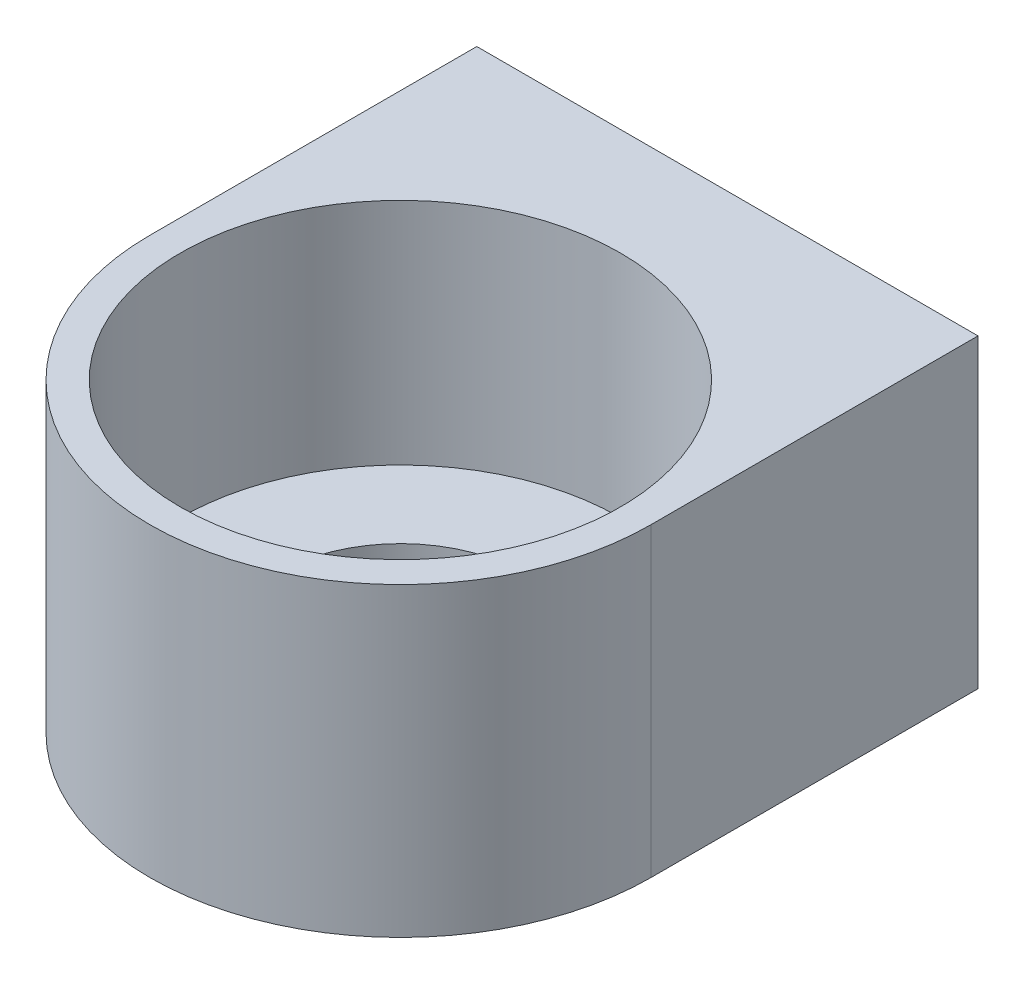
ISO-10303-21;
HEADER;
FILE_DESCRIPTION(('STEP AP214'),'2;1');
FILE_NAME('part.step','',(''),(''),'','','');
FILE_SCHEMA(('AUTOMOTIVE_DESIGN { 1 0 10303 214 1 1 1 1 }'));
ENDSEC;
DATA;
#1=APPLICATION_CONTEXT('core data for automotive mechanical design processes');
#2=APPLICATION_PROTOCOL_DEFINITION('international standard','automotive_design',2000,#1);
#3=PRODUCT_CONTEXT('',#1,'mechanical');
#4=PRODUCT('Part','Part','',(#3));
#5=PRODUCT_RELATED_PRODUCT_CATEGORY('part','',(#4));
#6=PRODUCT_DEFINITION_FORMATION('','',#4);
#7=PRODUCT_DEFINITION_CONTEXT('part definition',#1,'design');
#8=PRODUCT_DEFINITION('design','',#6,#7);
#9=PRODUCT_DEFINITION_SHAPE('','',#8);
#10=(LENGTH_UNIT() NAMED_UNIT(*) SI_UNIT(.MILLI.,.METRE.));
#11=(NAMED_UNIT(*) PLANE_ANGLE_UNIT() SI_UNIT($,.RADIAN.));
#12=(NAMED_UNIT(*) SI_UNIT($,.STERADIAN.) SOLID_ANGLE_UNIT());
#13=UNCERTAINTY_MEASURE_WITH_UNIT(LENGTH_MEASURE(1.E-05),#10,'distance_accuracy_value','');
#14=(GEOMETRIC_REPRESENTATION_CONTEXT(3) GLOBAL_UNCERTAINTY_ASSIGNED_CONTEXT((#13)) GLOBAL_UNIT_ASSIGNED_CONTEXT((#10,
#11,#12)) REPRESENTATION_CONTEXT('',''));
#15=CARTESIAN_POINT('',(0.,0.,0.));
#16=DIRECTION('',(0.,0.,1.));
#17=DIRECTION('',(1.,0.,0.));
#18=AXIS2_PLACEMENT_3D('',#15,#16,#17);
#19=CARTESIAN_POINT('',(-16.4,100.,0.));
#20=DIRECTION('',(1.,0.,0.));
#21=DIRECTION('',(0.,0.,-1.));
#22=AXIS2_PLACEMENT_3D('',#19,#20,#21);
#23=PLANE('',#22);
#24=DIRECTION('',(0.,0.,1.));
#25=VECTOR('',#24,1.);
#26=CARTESIAN_POINT('',(-16.4,20.,0.));
#27=LINE('',#26,#25);
#28=CARTESIAN_POINT('',(-16.4,20.,-21.4));
#29=VERTEX_POINT('',#28);
#30=CARTESIAN_POINT('',(-16.4,20.,0.));
#31=VERTEX_POINT('',#30);
#32=EDGE_CURVE('E59',#29,#31,#27,.T.);
#33=ORIENTED_EDGE('',*,*,#32,.F.);
#34=DIRECTION('',(0.,-1.,0.));
#35=VECTOR('',#34,1.);
#36=CARTESIAN_POINT('',(-16.4,100.,-21.4));
#37=LINE('',#36,#35);
#38=CARTESIAN_POINT('',(-16.4,0.,-21.4));
#39=VERTEX_POINT('',#38);
#40=EDGE_CURVE('E98',#29,#39,#37,.T.);
#41=ORIENTED_EDGE('',*,*,#40,.T.);
#42=DIRECTION('',(0.,0.,1.));
#43=VECTOR('',#42,1.);
#44=CARTESIAN_POINT('',(-16.4,0.,0.));
#45=LINE('',#44,#43);
#46=CARTESIAN_POINT('',(-16.4,0.,0.));
#47=VERTEX_POINT('',#46);
#48=EDGE_CURVE('E109',#39,#47,#45,.T.);
#49=ORIENTED_EDGE('',*,*,#48,.T.);
#50=DIRECTION('',(0.,-1.,0.));
#51=VECTOR('',#50,1.);
#52=CARTESIAN_POINT('',(-16.4,100.,0.));
#53=LINE('',#52,#51);
#54=EDGE_CURVE('E64',#31,#47,#53,.T.);
#55=ORIENTED_EDGE('',*,*,#54,.F.);
#56=EDGE_LOOP('',(#33,#41,#49,#55));
#57=FACE_BOUND('',#56,.T.);
#58=ADVANCED_FACE('F45',(#57),#23,.F.);
#59=CARTESIAN_POINT('',(0.,100.,0.));
#60=DIRECTION('',(0.,-1.,0.));
#61=DIRECTION('',(0.,0.,-1.));
#62=AXIS2_PLACEMENT_3D('',#59,#60,#61);
#63=CYLINDRICAL_SURFACE('',#62,8.1);
#64=CARTESIAN_POINT('',(0.,0.,0.));
#65=DIRECTION('',(0.,1.,0.));
#66=DIRECTION('',(0.,0.,1.));
#67=AXIS2_PLACEMENT_3D('',#64,#65,#66);
#68=CIRCLE('',#67,8.1);
#69=CARTESIAN_POINT('',(0.,0.,8.1));
#70=VERTEX_POINT('',#69);
#71=EDGE_CURVE('E95',#70,#70,#68,.T.);
#72=ORIENTED_EDGE('',*,*,#71,.F.);
#73=EDGE_LOOP('',(#72));
#74=FACE_BOUND('',#73,.T.);
#75=CARTESIAN_POINT('',(0.,5.,0.));
#76=DIRECTION('',(0.,1.,0.));
#77=DIRECTION('',(0.,0.,1.));
#78=AXIS2_PLACEMENT_3D('',#75,#76,#77);
#79=CIRCLE('',#78,8.1);
#80=CARTESIAN_POINT('',(0.,5.,8.1));
#81=VERTEX_POINT('',#80);
#82=EDGE_CURVE('E46',#81,#81,#79,.T.);
#83=ORIENTED_EDGE('',*,*,#82,.T.);
#84=EDGE_LOOP('',(#83));
#85=FACE_BOUND('',#84,.T.);
#86=ADVANCED_FACE('F181',(#74,#85),#63,.F.);
#87=CARTESIAN_POINT('',(16.4,100.,0.));
#88=DIRECTION('',(-1.,0.,0.));
#89=DIRECTION('',(0.,0.,1.));
#90=AXIS2_PLACEMENT_3D('',#87,#88,#89);
#91=PLANE('',#90);
#92=DIRECTION('',(0.,-1.,0.));
#93=VECTOR('',#92,1.);
#94=CARTESIAN_POINT('',(16.4,100.,-21.4));
#95=LINE('',#94,#93);
#96=CARTESIAN_POINT('',(16.4,20.,-21.4));
#97=VERTEX_POINT('',#96);
#98=CARTESIAN_POINT('',(16.4,0.,-21.4));
#99=VERTEX_POINT('',#98);
#100=EDGE_CURVE('E51',#97,#99,#95,.T.);
#101=ORIENTED_EDGE('',*,*,#100,.F.);
#102=DIRECTION('',(0.,0.,-1.));
#103=VECTOR('',#102,1.);
#104=CARTESIAN_POINT('',(16.4,20.,0.));
#105=LINE('',#104,#103);
#106=CARTESIAN_POINT('',(16.4,20.,0.));
#107=VERTEX_POINT('',#106);
#108=EDGE_CURVE('E83',#107,#97,#105,.T.);
#109=ORIENTED_EDGE('',*,*,#108,.F.);
#110=DIRECTION('',(0.,-1.,0.));
#111=VECTOR('',#110,1.);
#112=CARTESIAN_POINT('',(16.4,100.,0.));
#113=LINE('',#112,#111);
#114=CARTESIAN_POINT('',(16.4,0.,0.));
#115=VERTEX_POINT('',#114);
#116=EDGE_CURVE('E11',#107,#115,#113,.T.);
#117=ORIENTED_EDGE('',*,*,#116,.T.);
#118=DIRECTION('',(0.,0.,-1.));
#119=VECTOR('',#118,1.);
#120=CARTESIAN_POINT('',(16.4,0.,0.));
#121=LINE('',#120,#119);
#122=EDGE_CURVE('E102',#115,#99,#121,.T.);
#123=ORIENTED_EDGE('',*,*,#122,.T.);
#124=EDGE_LOOP('',(#101,#109,#117,#123));
#125=FACE_BOUND('',#124,.T.);
#126=ADVANCED_FACE('F105',(#125),#91,.F.);
#127=CARTESIAN_POINT('',(0.,100.,0.));
#128=DIRECTION('',(0.,-1.,0.));
#129=DIRECTION('',(0.,0.,-1.));
#130=AXIS2_PLACEMENT_3D('',#127,#128,#129);
#131=CYLINDRICAL_SURFACE('',#130,16.4);
#132=CARTESIAN_POINT('',(0.,20.,0.));
#133=DIRECTION('',(0.,1.,0.));
#134=DIRECTION('',(0.,0.,1.));
#135=AXIS2_PLACEMENT_3D('',#132,#133,#134);
#136=CIRCLE('',#135,16.4);
#137=EDGE_CURVE('E86',#31,#107,#136,.T.);
#138=ORIENTED_EDGE('',*,*,#137,.F.);
#139=ORIENTED_EDGE('',*,*,#54,.T.);
#140=CARTESIAN_POINT('',(0.,0.,0.));
#141=DIRECTION('',(0.,1.,0.));
#142=DIRECTION('',(0.,0.,1.));
#143=AXIS2_PLACEMENT_3D('',#140,#141,#142);
#144=CIRCLE('',#143,16.4);
#145=EDGE_CURVE('E113',#47,#115,#144,.T.);
#146=ORIENTED_EDGE('',*,*,#145,.T.);
#147=ORIENTED_EDGE('',*,*,#116,.F.);
#148=EDGE_LOOP('',(#138,#139,#146,#147));
#149=FACE_BOUND('',#148,.T.);
#150=ADVANCED_FACE('F42',(#149),#131,.T.);
#151=CARTESIAN_POINT('',(0.,0.,0.));
#152=DIRECTION('',(0.,1.,0.));
#153=DIRECTION('',(0.,0.,1.));
#154=AXIS2_PLACEMENT_3D('',#151,#152,#153);
#155=PLANE('',#154);
#156=ORIENTED_EDGE('',*,*,#145,.F.);
#157=ORIENTED_EDGE('',*,*,#48,.F.);
#158=DIRECTION('',(-1.,0.,0.));
#159=VECTOR('',#158,1.);
#160=CARTESIAN_POINT('',(-16.4,0.,-21.4));
#161=LINE('',#160,#159);
#162=EDGE_CURVE('E115',#99,#39,#161,.T.);
#163=ORIENTED_EDGE('',*,*,#162,.F.);
#164=ORIENTED_EDGE('',*,*,#122,.F.);
#165=EDGE_LOOP('',(#156,#157,#163,#164));
#166=FACE_BOUND('',#165,.T.);
#167=ORIENTED_EDGE('',*,*,#71,.T.);
#168=EDGE_LOOP('',(#167));
#169=FACE_BOUND('',#168,.T.);
#170=ADVANCED_FACE('F190',(#166,#169),#155,.F.);
#171=CARTESIAN_POINT('',(-16.4,100.,-21.4));
#172=DIRECTION('',(0.,0.,1.));
#173=DIRECTION('',(1.,0.,0.));
#174=AXIS2_PLACEMENT_3D('',#171,#172,#173);
#175=PLANE('',#174);
#176=ORIENTED_EDGE('',*,*,#40,.F.);
#177=DIRECTION('',(1.,0.,0.));
#178=VECTOR('',#177,1.);
#179=CARTESIAN_POINT('',(-16.4,20.,-21.4));
#180=LINE('',#179,#178);
#181=EDGE_CURVE('E88',#29,#97,#180,.T.);
#182=ORIENTED_EDGE('',*,*,#181,.T.);
#183=ORIENTED_EDGE('',*,*,#100,.T.);
#184=ORIENTED_EDGE('',*,*,#162,.T.);
#185=EDGE_LOOP('',(#176,#182,#183,#184));
#186=FACE_BOUND('',#185,.T.);
#187=ADVANCED_FACE('F92',(#186),#175,.F.);
#188=CARTESIAN_POINT('',(0.,20.,0.));
#189=DIRECTION('',(0.,1.,0.));
#190=DIRECTION('',(0.,0.,1.));
#191=AXIS2_PLACEMENT_3D('',#188,#189,#190);
#192=PLANE('',#191);
#193=CARTESIAN_POINT('',(0.,20.,0.));
#194=DIRECTION('',(0.,1.,0.));
#195=DIRECTION('',(0.,0.,1.));
#196=AXIS2_PLACEMENT_3D('',#193,#194,#195);
#197=CIRCLE('',#196,14.4);
#198=CARTESIAN_POINT('',(0.,20.,14.4));
#199=VERTEX_POINT('',#198);
#200=EDGE_CURVE('E97',#199,#199,#197,.T.);
#201=ORIENTED_EDGE('',*,*,#200,.F.);
#202=EDGE_LOOP('',(#201));
#203=FACE_BOUND('',#202,.T.);
#204=ORIENTED_EDGE('',*,*,#108,.T.);
#205=ORIENTED_EDGE('',*,*,#181,.F.);
#206=ORIENTED_EDGE('',*,*,#32,.T.);
#207=ORIENTED_EDGE('',*,*,#137,.T.);
#208=EDGE_LOOP('',(#204,#205,#206,#207));
#209=FACE_BOUND('',#208,.T.);
#210=ADVANCED_FACE('F84',(#203,#209),#192,.T.);
#211=CARTESIAN_POINT('',(0.,5.,0.));
#212=DIRECTION('',(0.,1.,0.));
#213=DIRECTION('',(0.,0.,1.));
#214=AXIS2_PLACEMENT_3D('',#211,#212,#213);
#215=CYLINDRICAL_SURFACE('',#214,14.4);
#216=CARTESIAN_POINT('',(0.,5.,0.));
#217=DIRECTION('',(0.,1.,0.));
#218=DIRECTION('',(0.,0.,1.));
#219=AXIS2_PLACEMENT_3D('',#216,#217,#218);
#220=CIRCLE('',#219,14.4);
#221=CARTESIAN_POINT('',(0.,5.,14.4));
#222=VERTEX_POINT('',#221);
#223=EDGE_CURVE('E123',#222,#222,#220,.T.);
#224=ORIENTED_EDGE('',*,*,#223,.F.);
#225=EDGE_LOOP('',(#224));
#226=FACE_BOUND('',#225,.T.);
#227=ORIENTED_EDGE('',*,*,#200,.T.);
#228=EDGE_LOOP('',(#227));
#229=FACE_BOUND('',#228,.T.);
#230=ADVANCED_FACE('F176',(#226,#229),#215,.F.);
#231=CARTESIAN_POINT('',(0.,5.,0.));
#232=DIRECTION('',(0.,1.,0.));
#233=DIRECTION('',(0.,0.,1.));
#234=AXIS2_PLACEMENT_3D('',#231,#232,#233);
#235=PLANE('',#234);
#236=ORIENTED_EDGE('',*,*,#82,.F.);
#237=EDGE_LOOP('',(#236));
#238=FACE_BOUND('',#237,.T.);
#239=ORIENTED_EDGE('',*,*,#223,.T.);
#240=EDGE_LOOP('',(#239));
#241=FACE_BOUND('',#240,.T.);
#242=ADVANCED_FACE('F171',(#238,#241),#235,.T.);
#243=CLOSED_SHELL('',(#58,#86,#126,#150,#170,#187,#210,#230,#242));
#244=CARTESIAN_POINT('',(-11.3669214310838,14.9,-16.1762282680987));
#245=DIRECTION('',(0.,1.,0.));
#246=DIRECTION('',(0.,0.,1.));
#247=AXIS2_PLACEMENT_3D('',#244,#245,#246);
#248=CYLINDRICAL_SURFACE('',#247,4.1);
#249=CARTESIAN_POINT('',(-11.3669214310838,14.9,-16.1762282680987));
#250=DIRECTION('',(0.,1.,0.));
#251=DIRECTION('',(0.,0.,1.));
#252=AXIS2_PLACEMENT_3D('',#249,#250,#251);
#253=CIRCLE('',#252,4.1);
#254=CARTESIAN_POINT('',(-11.3669214310838,14.9,-12.0762282680987));
#255=VERTEX_POINT('',#254);
#256=EDGE_CURVE('E99',#255,#255,#253,.T.);
#257=CARTESIAN_POINT('',(-11.3669214310838,18.,-16.1762282680987));
#258=DIRECTION('',(0.,1.,0.));
#259=DIRECTION('',(0.,0.,1.));
#260=AXIS2_PLACEMENT_3D('',#257,#258,#259);
#261=CIRCLE('',#260,4.1);
#262=CARTESIAN_POINT('',(-11.3669214310838,18.,-12.0762282680987));
#263=VERTEX_POINT('',#262);
#264=EDGE_CURVE('E127',#263,#263,#261,.T.);
#265=CARTESIAN_POINT('',(-11.3669214310838,14.9,-12.0762282680987));
#266=CARTESIAN_POINT('',(-11.3669214310838,14.9322916666667,-12.0762282680987));
#267=CARTESIAN_POINT('',(-11.3669214310838,14.9645833333333,-12.0762282680987));
#268=CARTESIAN_POINT('',(-11.3669214310838,15.0291666666667,-12.0762282680987));
#269=CARTESIAN_POINT('',(-11.3669214310838,15.0614583333333,-12.0762282680987));
#270=CARTESIAN_POINT('',(-11.3669214310838,15.1260416666667,-12.0762282680987));
#271=CARTESIAN_POINT('',(-11.3669214310838,15.1583333333333,-12.0762282680987));
#272=CARTESIAN_POINT('',(-11.3669214310838,15.2229166666667,-12.0762282680987));
#273=CARTESIAN_POINT('',(-11.3669214310838,15.2552083333333,-12.0762282680987));
#274=CARTESIAN_POINT('',(-11.3669214310838,15.3197916666667,-12.0762282680987));
#275=CARTESIAN_POINT('',(-11.3669214310838,15.3520833333333,-12.0762282680987));
#276=CARTESIAN_POINT('',(-11.3669214310838,15.4166666666667,-12.0762282680987));
#277=CARTESIAN_POINT('',(-11.3669214310838,15.4489583333333,-12.0762282680987));
#278=CARTESIAN_POINT('',(-11.3669214310838,15.5135416666667,-12.0762282680987));
#279=CARTESIAN_POINT('',(-11.3669214310838,15.5458333333333,-12.0762282680987));
#280=CARTESIAN_POINT('',(-11.3669214310838,15.6104166666667,-12.0762282680987));
#281=CARTESIAN_POINT('',(-11.3669214310838,15.6427083333333,-12.0762282680987));
#282=CARTESIAN_POINT('',(-11.3669214310838,15.7072916666667,-12.0762282680987));
#283=CARTESIAN_POINT('',(-11.3669214310838,15.7395833333333,-12.0762282680987));
#284=CARTESIAN_POINT('',(-11.3669214310838,15.8041666666667,-12.0762282680987));
#285=CARTESIAN_POINT('',(-11.3669214310838,15.8364583333333,-12.0762282680987));
#286=CARTESIAN_POINT('',(-11.3669214310838,15.9010416666667,-12.0762282680987));
#287=CARTESIAN_POINT('',(-11.3669214310838,15.9333333333333,-12.0762282680987));
#288=CARTESIAN_POINT('',(-11.3669214310838,15.9979166666667,-12.0762282680987));
#289=CARTESIAN_POINT('',(-11.3669214310838,16.0302083333333,-12.0762282680987));
#290=CARTESIAN_POINT('',(-11.3669214310838,16.0947916666667,-12.0762282680987));
#291=CARTESIAN_POINT('',(-11.3669214310838,16.1270833333333,-12.0762282680987));
#292=CARTESIAN_POINT('',(-11.3669214310838,16.1916666666667,-12.0762282680987));
#293=CARTESIAN_POINT('',(-11.3669214310838,16.2239583333333,-12.0762282680987));
#294=CARTESIAN_POINT('',(-11.3669214310838,16.2885416666667,-12.0762282680987));
#295=CARTESIAN_POINT('',(-11.3669214310838,16.3208333333333,-12.0762282680987));
#296=CARTESIAN_POINT('',(-11.3669214310838,16.3854166666667,-12.0762282680987));
#297=CARTESIAN_POINT('',(-11.3669214310838,16.4177083333333,-12.0762282680987));
#298=CARTESIAN_POINT('',(-11.3669214310838,16.4822916666667,-12.0762282680987));
#299=CARTESIAN_POINT('',(-11.3669214310838,16.5145833333333,-12.0762282680987));
#300=CARTESIAN_POINT('',(-11.3669214310838,16.5791666666667,-12.0762282680987));
#301=CARTESIAN_POINT('',(-11.3669214310838,16.6114583333333,-12.0762282680987));
#302=CARTESIAN_POINT('',(-11.3669214310838,16.6760416666667,-12.0762282680987));
#303=CARTESIAN_POINT('',(-11.3669214310838,16.7083333333333,-12.0762282680987));
#304=CARTESIAN_POINT('',(-11.3669214310838,16.7729166666667,-12.0762282680987));
#305=CARTESIAN_POINT('',(-11.3669214310838,16.8052083333333,-12.0762282680987));
#306=CARTESIAN_POINT('',(-11.3669214310838,16.8697916666667,-12.0762282680987));
#307=CARTESIAN_POINT('',(-11.3669214310838,16.9020833333333,-12.0762282680987));
#308=CARTESIAN_POINT('',(-11.3669214310838,16.9666666666667,-12.0762282680987));
#309=CARTESIAN_POINT('',(-11.3669214310838,16.9989583333333,-12.0762282680987));
#310=CARTESIAN_POINT('',(-11.3669214310838,17.0635416666667,-12.0762282680987));
#311=CARTESIAN_POINT('',(-11.3669214310838,17.0958333333333,-12.0762282680987));
#312=CARTESIAN_POINT('',(-11.3669214310838,17.1604166666667,-12.0762282680987));
#313=CARTESIAN_POINT('',(-11.3669214310838,17.1927083333333,-12.0762282680987));
#314=CARTESIAN_POINT('',(-11.3669214310838,17.2572916666667,-12.0762282680987));
#315=CARTESIAN_POINT('',(-11.3669214310838,17.2895833333333,-12.0762282680987));
#316=CARTESIAN_POINT('',(-11.3669214310838,17.3541666666667,-12.0762282680987));
#317=CARTESIAN_POINT('',(-11.3669214310838,17.3864583333333,-12.0762282680987));
#318=CARTESIAN_POINT('',(-11.3669214310838,17.4510416666667,-12.0762282680987));
#319=CARTESIAN_POINT('',(-11.3669214310838,17.4833333333333,-12.0762282680987));
#320=CARTESIAN_POINT('',(-11.3669214310838,17.5479166666667,-12.0762282680987));
#321=CARTESIAN_POINT('',(-11.3669214310838,17.5802083333333,-12.0762282680987));
#322=CARTESIAN_POINT('',(-11.3669214310838,17.6447916666667,-12.0762282680987));
#323=CARTESIAN_POINT('',(-11.3669214310838,17.6770833333333,-12.0762282680987));
#324=CARTESIAN_POINT('',(-11.3669214310838,17.7416666666667,-12.0762282680987));
#325=CARTESIAN_POINT('',(-11.3669214310838,17.7739583333333,-12.0762282680987));
#326=CARTESIAN_POINT('',(-11.3669214310838,17.8385416666667,-12.0762282680987));
#327=CARTESIAN_POINT('',(-11.3669214310838,17.8708333333333,-12.0762282680987));
#328=CARTESIAN_POINT('',(-11.3669214310838,17.9354166666667,-12.0762282680987));
#329=CARTESIAN_POINT('',(-11.3669214310838,17.9677083333333,-12.0762282680987));
#330=CARTESIAN_POINT('',(-11.3669214310838,18.,-12.0762282680987));
#331=B_SPLINE_CURVE_WITH_KNOTS('',3,(#265,#266,#267,#268,#269,#270,#271,#272,#273,#274,#275,
#276,#277,#278,#279,#280,#281,#282,#283,#284,#285,#286,#287,#288,#289,#290,#291,#292,#293,#294,
#295,#296,#297,#298,#299,#300,#301,#302,#303,#304,#305,#306,#307,#308,#309,#310,#311,#312,#313,
#314,#315,#316,#317,#318,#319,#320,#321,#322,#323,#324,#325,#326,#327,#328,#329,#330),
.UNSPECIFIED.,.F.,.F.,(4,2,2,2,2,2,2,2,2,2,2,2,2,2,2,2,2,2,2,2,2,2,2,2,2,2,2,2,2,2,2,2,4),(0.,
0.0968749999999997,0.193749999999999,0.290624999999999,0.387499999999999,0.484374999999999,
0.581249999999998,0.678124999999998,0.775,0.871874999999999,0.968749999999999,1.065625,1.1625,
1.259375,1.35625,1.453125,1.55,1.646875,1.74375,1.840625,1.9375,2.034375,2.13125,2.228125,2.325,
2.421875,2.51875,2.615625,2.7125,2.809375,2.90625,3.003125,3.1),.UNSPECIFIED.);
#332=EDGE_CURVE('BSEAM160',#255,#263,#331,.T.);
#333=ORIENTED_EDGE('',*,*,#256,.F.);
#334=ORIENTED_EDGE('',*,*,#264,.T.);
#335=ORIENTED_EDGE('',*,*,#332,.T.);
#336=ORIENTED_EDGE('',*,*,#332,.F.);
#337=EDGE_LOOP('',(#333,#335,#334,#336));
#338=FACE_BOUND('',#337,.T.);
#339=ADVANCED_FACE('F160',(#338),#248,.F.);
#340=CARTESIAN_POINT('',(-11.3669214310838,14.9,-16.1762282680987));
#341=DIRECTION('',(0.,1.,0.));
#342=DIRECTION('',(0.,0.,1.));
#343=AXIS2_PLACEMENT_3D('',#340,#341,#342);
#344=PLANE('',#343);
#345=ORIENTED_EDGE('',*,*,#256,.T.);
#346=EDGE_LOOP('',(#345));
#347=FACE_BOUND('',#346,.T.);
#348=ADVANCED_FACE('F157',(#347),#344,.T.);
#349=CARTESIAN_POINT('',(-11.3669214310838,18.,-16.1762282680987));
#350=DIRECTION('',(0.,1.,0.));
#351=DIRECTION('',(0.,0.,1.));
#352=AXIS2_PLACEMENT_3D('',#349,#350,#351);
#353=PLANE('',#352);
#354=ORIENTED_EDGE('',*,*,#264,.F.);
#355=EDGE_LOOP('',(#354));
#356=FACE_BOUND('',#355,.T.);
#357=ADVANCED_FACE('F167',(#356),#353,.F.);
#358=CLOSED_SHELL('',(#339,#348,#357));
#359=CARTESIAN_POINT('',(11.3669214310838,14.9,-16.1762282680987));
#360=DIRECTION('',(0.,1.,0.));
#361=DIRECTION('',(0.,0.,1.));
#362=AXIS2_PLACEMENT_3D('',#359,#360,#361);
#363=CYLINDRICAL_SURFACE('',#362,4.1);
#364=CARTESIAN_POINT('',(11.3669214310838,14.9,-16.1762282680987));
#365=DIRECTION('',(0.,-1.,0.));
#366=DIRECTION('',(0.,0.,1.));
#367=AXIS2_PLACEMENT_3D('',#364,#365,#366);
#368=CIRCLE('',#367,4.1);
#369=CARTESIAN_POINT('',(11.3669214310838,14.9,-12.0762282680987));
#370=VERTEX_POINT('',#369);
#371=EDGE_CURVE('E129',#370,#370,#368,.T.);
#372=CARTESIAN_POINT('',(11.3669214310838,18.,-16.1762282680987));
#373=DIRECTION('',(0.,-1.,0.));
#374=DIRECTION('',(0.,0.,1.));
#375=AXIS2_PLACEMENT_3D('',#372,#373,#374);
#376=CIRCLE('',#375,4.1);
#377=CARTESIAN_POINT('',(11.3669214310838,18.,-12.0762282680987));
#378=VERTEX_POINT('',#377);
#379=EDGE_CURVE('E135',#378,#378,#376,.T.);
#380=CARTESIAN_POINT('',(11.3669214310838,14.9,-12.0762282680987));
#381=CARTESIAN_POINT('',(11.3669214310838,14.9322916666667,-12.0762282680987));
#382=CARTESIAN_POINT('',(11.3669214310838,14.9645833333333,-12.0762282680987));
#383=CARTESIAN_POINT('',(11.3669214310838,15.0291666666667,-12.0762282680987));
#384=CARTESIAN_POINT('',(11.3669214310838,15.0614583333333,-12.0762282680987));
#385=CARTESIAN_POINT('',(11.3669214310838,15.1260416666667,-12.0762282680987));
#386=CARTESIAN_POINT('',(11.3669214310838,15.1583333333333,-12.0762282680987));
#387=CARTESIAN_POINT('',(11.3669214310838,15.2229166666667,-12.0762282680987));
#388=CARTESIAN_POINT('',(11.3669214310838,15.2552083333333,-12.0762282680987));
#389=CARTESIAN_POINT('',(11.3669214310838,15.3197916666667,-12.0762282680987));
#390=CARTESIAN_POINT('',(11.3669214310838,15.3520833333333,-12.0762282680987));
#391=CARTESIAN_POINT('',(11.3669214310838,15.4166666666667,-12.0762282680987));
#392=CARTESIAN_POINT('',(11.3669214310838,15.4489583333333,-12.0762282680987));
#393=CARTESIAN_POINT('',(11.3669214310838,15.5135416666667,-12.0762282680987));
#394=CARTESIAN_POINT('',(11.3669214310838,15.5458333333333,-12.0762282680987));
#395=CARTESIAN_POINT('',(11.3669214310838,15.6104166666667,-12.0762282680987));
#396=CARTESIAN_POINT('',(11.3669214310838,15.6427083333333,-12.0762282680987));
#397=CARTESIAN_POINT('',(11.3669214310838,15.7072916666667,-12.0762282680987));
#398=CARTESIAN_POINT('',(11.3669214310838,15.7395833333333,-12.0762282680987));
#399=CARTESIAN_POINT('',(11.3669214310838,15.8041666666667,-12.0762282680987));
#400=CARTESIAN_POINT('',(11.3669214310838,15.8364583333333,-12.0762282680987));
#401=CARTESIAN_POINT('',(11.3669214310838,15.9010416666667,-12.0762282680987));
#402=CARTESIAN_POINT('',(11.3669214310838,15.9333333333333,-12.0762282680987));
#403=CARTESIAN_POINT('',(11.3669214310838,15.9979166666667,-12.0762282680987));
#404=CARTESIAN_POINT('',(11.3669214310838,16.0302083333333,-12.0762282680987));
#405=CARTESIAN_POINT('',(11.3669214310838,16.0947916666667,-12.0762282680987));
#406=CARTESIAN_POINT('',(11.3669214310838,16.1270833333333,-12.0762282680987));
#407=CARTESIAN_POINT('',(11.3669214310838,16.1916666666667,-12.0762282680987));
#408=CARTESIAN_POINT('',(11.3669214310838,16.2239583333333,-12.0762282680987));
#409=CARTESIAN_POINT('',(11.3669214310838,16.2885416666667,-12.0762282680987));
#410=CARTESIAN_POINT('',(11.3669214310838,16.3208333333333,-12.0762282680987));
#411=CARTESIAN_POINT('',(11.3669214310838,16.3854166666667,-12.0762282680987));
#412=CARTESIAN_POINT('',(11.3669214310838,16.4177083333333,-12.0762282680987));
#413=CARTESIAN_POINT('',(11.3669214310838,16.4822916666667,-12.0762282680987));
#414=CARTESIAN_POINT('',(11.3669214310838,16.5145833333333,-12.0762282680987));
#415=CARTESIAN_POINT('',(11.3669214310838,16.5791666666667,-12.0762282680987));
#416=CARTESIAN_POINT('',(11.3669214310838,16.6114583333333,-12.0762282680987));
#417=CARTESIAN_POINT('',(11.3669214310838,16.6760416666667,-12.0762282680987));
#418=CARTESIAN_POINT('',(11.3669214310838,16.7083333333333,-12.0762282680987));
#419=CARTESIAN_POINT('',(11.3669214310838,16.7729166666667,-12.0762282680987));
#420=CARTESIAN_POINT('',(11.3669214310838,16.8052083333333,-12.0762282680987));
#421=CARTESIAN_POINT('',(11.3669214310838,16.8697916666667,-12.0762282680987));
#422=CARTESIAN_POINT('',(11.3669214310838,16.9020833333333,-12.0762282680987));
#423=CARTESIAN_POINT('',(11.3669214310838,16.9666666666667,-12.0762282680987));
#424=CARTESIAN_POINT('',(11.3669214310838,16.9989583333333,-12.0762282680987));
#425=CARTESIAN_POINT('',(11.3669214310838,17.0635416666667,-12.0762282680987));
#426=CARTESIAN_POINT('',(11.3669214310838,17.0958333333333,-12.0762282680987));
#427=CARTESIAN_POINT('',(11.3669214310838,17.1604166666667,-12.0762282680987));
#428=CARTESIAN_POINT('',(11.3669214310838,17.1927083333333,-12.0762282680987));
#429=CARTESIAN_POINT('',(11.3669214310838,17.2572916666667,-12.0762282680987));
#430=CARTESIAN_POINT('',(11.3669214310838,17.2895833333333,-12.0762282680987));
#431=CARTESIAN_POINT('',(11.3669214310838,17.3541666666667,-12.0762282680987));
#432=CARTESIAN_POINT('',(11.3669214310838,17.3864583333333,-12.0762282680987));
#433=CARTESIAN_POINT('',(11.3669214310838,17.4510416666667,-12.0762282680987));
#434=CARTESIAN_POINT('',(11.3669214310838,17.4833333333333,-12.0762282680987));
#435=CARTESIAN_POINT('',(11.3669214310838,17.5479166666667,-12.0762282680987));
#436=CARTESIAN_POINT('',(11.3669214310838,17.5802083333333,-12.0762282680987));
#437=CARTESIAN_POINT('',(11.3669214310838,17.6447916666667,-12.0762282680987));
#438=CARTESIAN_POINT('',(11.3669214310838,17.6770833333333,-12.0762282680987));
#439=CARTESIAN_POINT('',(11.3669214310838,17.7416666666667,-12.0762282680987));
#440=CARTESIAN_POINT('',(11.3669214310838,17.7739583333333,-12.0762282680987));
#441=CARTESIAN_POINT('',(11.3669214310838,17.8385416666667,-12.0762282680987));
#442=CARTESIAN_POINT('',(11.3669214310838,17.8708333333333,-12.0762282680987));
#443=CARTESIAN_POINT('',(11.3669214310838,17.9354166666667,-12.0762282680987));
#444=CARTESIAN_POINT('',(11.3669214310838,17.9677083333333,-12.0762282680987));
#445=CARTESIAN_POINT('',(11.3669214310838,18.,-12.0762282680987));
#446=B_SPLINE_CURVE_WITH_KNOTS('',3,(#380,#381,#382,#383,#384,#385,#386,#387,#388,#389,#390,
#391,#392,#393,#394,#395,#396,#397,#398,#399,#400,#401,#402,#403,#404,#405,#406,#407,#408,#409,
#410,#411,#412,#413,#414,#415,#416,#417,#418,#419,#420,#421,#422,#423,#424,#425,#426,#427,#428,
#429,#430,#431,#432,#433,#434,#435,#436,#437,#438,#439,#440,#441,#442,#443,#444,#445),
.UNSPECIFIED.,.F.,.F.,(4,2,2,2,2,2,2,2,2,2,2,2,2,2,2,2,2,2,2,2,2,2,2,2,2,2,2,2,2,2,2,2,4),(0.,
0.0968749999999997,0.193749999999999,0.290624999999999,0.387499999999999,0.484374999999999,
0.58125,0.678125,0.774999999999998,0.871875000000001,0.968750000000001,1.065625,1.1625,1.259375,
1.35625,1.453125,1.55,1.646875,1.74375,1.840625,1.9375,2.034375,2.13125,2.228125,2.325,2.421875,
2.51875,2.615625,2.7125,2.809375,2.90625,3.003125,3.1),.UNSPECIFIED.);
#447=EDGE_CURVE('BSEAM138',#370,#378,#446,.T.);
#448=ORIENTED_EDGE('',*,*,#371,.T.);
#449=ORIENTED_EDGE('',*,*,#379,.F.);
#450=ORIENTED_EDGE('',*,*,#447,.T.);
#451=ORIENTED_EDGE('',*,*,#447,.F.);
#452=EDGE_LOOP('',(#448,#450,#449,#451));
#453=FACE_BOUND('',#452,.T.);
#454=ADVANCED_FACE('F138',(#453),#363,.F.);
#455=CARTESIAN_POINT('',(11.3669214310838,14.9,-16.1762282680987));
#456=DIRECTION('',(0.,1.,0.));
#457=DIRECTION('',(0.,0.,1.));
#458=AXIS2_PLACEMENT_3D('',#455,#456,#457);
#459=PLANE('',#458);
#460=ORIENTED_EDGE('',*,*,#371,.F.);
#461=EDGE_LOOP('',(#460));
#462=FACE_BOUND('',#461,.T.);
#463=ADVANCED_FACE('F143',(#462),#459,.T.);
#464=CARTESIAN_POINT('',(11.3669214310838,18.,-16.1762282680987));
#465=DIRECTION('',(0.,1.,0.));
#466=DIRECTION('',(0.,0.,1.));
#467=AXIS2_PLACEMENT_3D('',#464,#465,#466);
#468=PLANE('',#467);
#469=ORIENTED_EDGE('',*,*,#379,.T.);
#470=EDGE_LOOP('',(#469));
#471=FACE_BOUND('',#470,.T.);
#472=ADVANCED_FACE('F141',(#471),#468,.F.);
#473=CLOSED_SHELL('',(#454,#463,#472));
#474=ORIENTED_CLOSED_SHELL('',*,#358,.T.);
#475=ORIENTED_CLOSED_SHELL('',*,#473,.T.);
#476=BREP_WITH_VOIDS('B2',#243,(#474,#475));
#477=ADVANCED_BREP_SHAPE_REPRESENTATION('',(#18,#476),#14);
#478=SHAPE_DEFINITION_REPRESENTATION(#9,#477);
ENDSEC;
END-ISO-10303-21;
